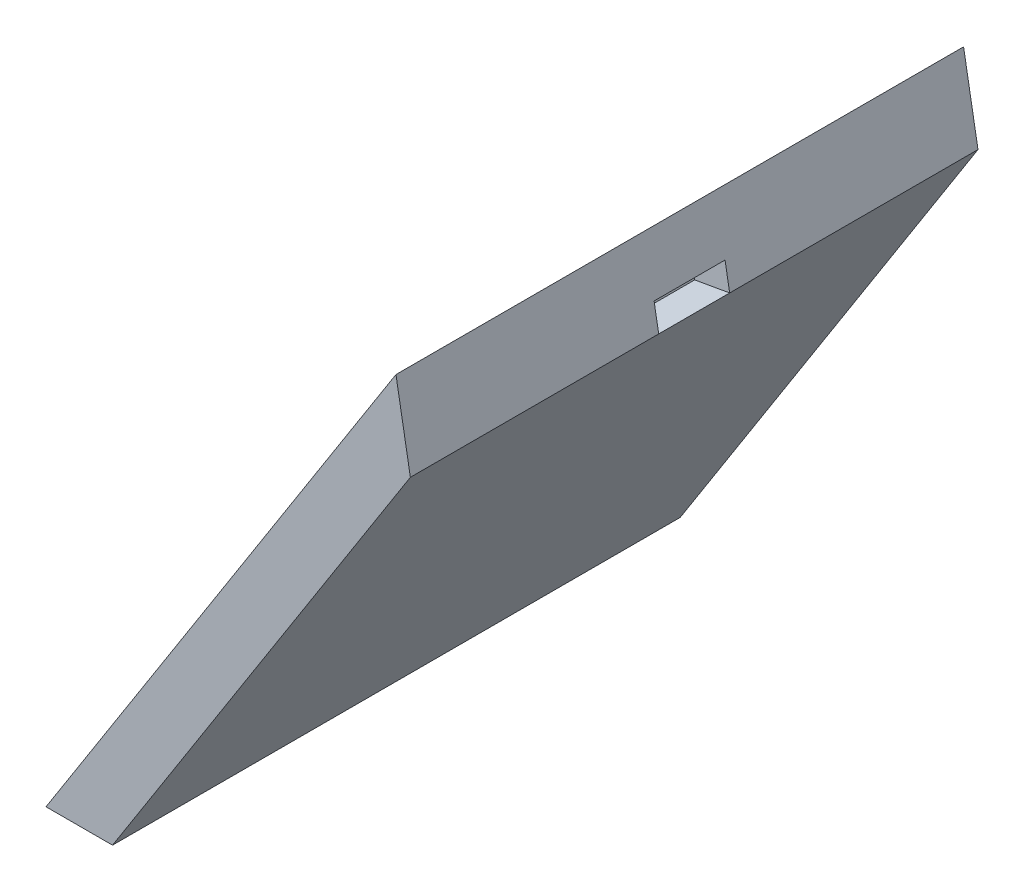
ISO-10303-21;
HEADER;
FILE_DESCRIPTION(('STEP AP214'),'2;1');
FILE_NAME('part.step','',(''),(''),'','','');
FILE_SCHEMA(('AUTOMOTIVE_DESIGN { 1 0 10303 214 1 1 1 1 }'));
ENDSEC;
DATA;
#1=APPLICATION_CONTEXT('core data for automotive mechanical design processes');
#2=APPLICATION_PROTOCOL_DEFINITION('international standard','automotive_design',2000,#1);
#3=PRODUCT_CONTEXT('',#1,'mechanical');
#4=PRODUCT('Part','Part','',(#3));
#5=PRODUCT_RELATED_PRODUCT_CATEGORY('part','',(#4));
#6=PRODUCT_DEFINITION_FORMATION('','',#4);
#7=PRODUCT_DEFINITION_CONTEXT('part definition',#1,'design');
#8=PRODUCT_DEFINITION('design','',#6,#7);
#9=PRODUCT_DEFINITION_SHAPE('','',#8);
#10=(LENGTH_UNIT() NAMED_UNIT(*) SI_UNIT(.MILLI.,.METRE.));
#11=(NAMED_UNIT(*) PLANE_ANGLE_UNIT() SI_UNIT($,.RADIAN.));
#12=(NAMED_UNIT(*) SI_UNIT($,.STERADIAN.) SOLID_ANGLE_UNIT());
#13=UNCERTAINTY_MEASURE_WITH_UNIT(LENGTH_MEASURE(1.E-05),#10,'distance_accuracy_value','');
#14=(GEOMETRIC_REPRESENTATION_CONTEXT(3) GLOBAL_UNCERTAINTY_ASSIGNED_CONTEXT((#13)) GLOBAL_UNIT_ASSIGNED_CONTEXT((#10,
#11,#12)) REPRESENTATION_CONTEXT('',''));
#15=CARTESIAN_POINT('',(0.,0.,0.));
#16=DIRECTION('',(0.,0.,1.));
#17=DIRECTION('',(1.,0.,0.));
#18=AXIS2_PLACEMENT_3D('',#15,#16,#17);
#19=CARTESIAN_POINT('',(39.4561840184058,61.9338029817856,64.));
#20=DIRECTION('',(0.843391445812887,-0.537299608346821,0.));
#21=DIRECTION('',(0.537299608346822,0.843391445812887,0.));
#22=AXIS2_PLACEMENT_3D('',#19,#20,#21);
#23=PLANE('',#22);
#24=DIRECTION('',(-0.537299608346822,-0.843391445812887,0.));
#25=VECTOR('',#24,1.);
#26=CARTESIAN_POINT('',(39.4561840184058,61.9338029817856,0.));
#27=LINE('',#26,#25);
#28=CARTESIAN_POINT('',(39.4561840184058,61.9338029817856,0.));
#29=VERTEX_POINT('',#28);
#30=CARTESIAN_POINT('',(0.,0.,0.));
#31=VERTEX_POINT('',#30);
#32=EDGE_CURVE('E159',#29,#31,#27,.T.);
#33=ORIENTED_EDGE('',*,*,#32,.T.);
#34=DIRECTION('',(0.,0.,-1.));
#35=VECTOR('',#34,1.);
#36=CARTESIAN_POINT('',(0.,0.,64.));
#37=LINE('',#36,#35);
#38=CARTESIAN_POINT('',(0.,0.,64.));
#39=VERTEX_POINT('',#38);
#40=EDGE_CURVE('E11',#39,#31,#37,.T.);
#41=ORIENTED_EDGE('',*,*,#40,.F.);
#42=DIRECTION('',(-0.537299608346822,-0.843391445812887,0.));
#43=VECTOR('',#42,1.);
#44=CARTESIAN_POINT('',(39.4561840184058,61.9338029817856,64.));
#45=LINE('',#44,#43);
#46=CARTESIAN_POINT('',(39.4561840184058,61.9338029817856,64.));
#47=VERTEX_POINT('',#46);
#48=EDGE_CURVE('E165',#47,#39,#45,.T.);
#49=ORIENTED_EDGE('',*,*,#48,.F.);
#50=DIRECTION('',(0.,0.,-1.));
#51=VECTOR('',#50,1.);
#52=CARTESIAN_POINT('',(39.4561840184058,61.9338029817856,64.));
#53=LINE('',#52,#51);
#54=EDGE_CURVE('E175',#47,#29,#53,.T.);
#55=ORIENTED_EDGE('',*,*,#54,.T.);
#56=EDGE_LOOP('',(#33,#41,#49,#55));
#57=FACE_BOUND('',#56,.T.);
#58=ADVANCED_FACE('F39',(#57),#23,.F.);
#59=CARTESIAN_POINT('',(0.,0.,64.));
#60=DIRECTION('',(0.,1.,0.));
#61=DIRECTION('',(0.,0.,1.));
#62=AXIS2_PLACEMENT_3D('',#59,#60,#61);
#63=PLANE('',#62);
#64=DIRECTION('',(1.,0.,0.));
#65=VECTOR('',#64,1.);
#66=CARTESIAN_POINT('',(0.,0.,0.));
#67=LINE('',#66,#65);
#68=CARTESIAN_POINT('',(7.5,0.,0.));
#69=VERTEX_POINT('',#68);
#70=EDGE_CURVE('E179',#31,#69,#67,.T.);
#71=ORIENTED_EDGE('',*,*,#70,.T.);
#72=DIRECTION('',(0.,0.,-1.));
#73=VECTOR('',#72,1.);
#74=CARTESIAN_POINT('',(7.5,0.,64.));
#75=LINE('',#74,#73);
#76=CARTESIAN_POINT('',(7.5,0.,64.));
#77=VERTEX_POINT('',#76);
#78=EDGE_CURVE('E47',#77,#69,#75,.T.);
#79=ORIENTED_EDGE('',*,*,#78,.F.);
#80=DIRECTION('',(1.,0.,0.));
#81=VECTOR('',#80,1.);
#82=CARTESIAN_POINT('',(0.,0.,64.));
#83=LINE('',#82,#81);
#84=EDGE_CURVE('E90',#39,#77,#83,.T.);
#85=ORIENTED_EDGE('',*,*,#84,.F.);
#86=ORIENTED_EDGE('',*,*,#40,.T.);
#87=EDGE_LOOP('',(#71,#79,#85,#86));
#88=FACE_BOUND('',#87,.T.);
#89=ADVANCED_FACE('F225',(#88),#63,.F.);
#90=CARTESIAN_POINT('',(7.5,0.,64.));
#91=DIRECTION('',(-0.843391445812887,0.537299608346822,0.));
#92=DIRECTION('',(-0.537299608346822,-0.843391445812887,0.));
#93=AXIS2_PLACEMENT_3D('',#90,#91,#92);
#94=PLANE('',#93);
#95=DIRECTION('',(0.537299608346822,0.843391445812887,0.));
#96=VECTOR('',#95,1.);
#97=CARTESIAN_POINT('',(7.5,0.,0.));
#98=LINE('',#97,#96);
#99=CARTESIAN_POINT('',(41.0812255216763,52.7119653633054,0.));
#100=VERTEX_POINT('',#99);
#101=EDGE_CURVE('E182',#69,#100,#98,.T.);
#102=ORIENTED_EDGE('',*,*,#101,.T.);
#103=DIRECTION('',(0.,0.,-1.));
#104=VECTOR('',#103,1.);
#105=CARTESIAN_POINT('',(41.0812255216763,52.7119653633054,64.));
#106=LINE('',#105,#104);
#107=CARTESIAN_POINT('',(41.0812255216763,52.7119653633054,28.));
#108=VERTEX_POINT('',#107);
#109=EDGE_CURVE('E190',#108,#100,#106,.T.);
#110=ORIENTED_EDGE('',*,*,#109,.F.);
#111=DIRECTION('',(0.,0.,-1.));
#112=VECTOR('',#111,1.);
#113=CARTESIAN_POINT('',(41.0812255216763,52.7119653633054,32.));
#114=LINE('',#113,#112);
#115=CARTESIAN_POINT('',(41.0812255216763,52.7119653633054,36.));
#116=VERTEX_POINT('',#115);
#117=EDGE_CURVE('E128',#116,#108,#114,.T.);
#118=ORIENTED_EDGE('',*,*,#117,.F.);
#119=CARTESIAN_POINT('',(41.0812255216763,52.7119653633054,64.));
#120=VERTEX_POINT('',#119);
#121=EDGE_CURVE('E191',#120,#116,#106,.T.);
#122=ORIENTED_EDGE('',*,*,#121,.F.);
#123=DIRECTION('',(0.537299608346822,0.843391445812887,0.));
#124=VECTOR('',#123,1.);
#125=CARTESIAN_POINT('',(7.5,0.,64.));
#126=LINE('',#125,#124);
#127=EDGE_CURVE('E170',#77,#120,#126,.T.);
#128=ORIENTED_EDGE('',*,*,#127,.F.);
#129=ORIENTED_EDGE('',*,*,#78,.T.);
#130=EDGE_LOOP('',(#102,#110,#118,#122,#128,#129));
#131=FACE_BOUND('',#130,.T.);
#132=ADVANCED_FACE('F199',(#131),#94,.F.);
#133=CARTESIAN_POINT('',(41.0812255216763,52.7119653633054,64.));
#134=DIRECTION('',(-0.984826325618199,-0.173542814225644,0.));
#135=DIRECTION('',(0.173542814225644,-0.9848263256182,0.));
#136=AXIS2_PLACEMENT_3D('',#133,#134,#135);
#137=PLANE('',#136);
#138=ORIENTED_EDGE('',*,*,#121,.T.);
#139=DIRECTION('',(0.173542814225642,-0.9848263256182,0.));
#140=VECTOR('',#139,1.);
#141=CARTESIAN_POINT('',(40.5605970789994,55.66644434016,36.));
#142=LINE('',#141,#140);
#143=CARTESIAN_POINT('',(40.5605970789994,55.66644434016,36.));
#144=VERTEX_POINT('',#143);
#145=EDGE_CURVE('E54',#144,#116,#142,.T.);
#146=ORIENTED_EDGE('',*,*,#145,.F.);
#147=DIRECTION('',(0.,0.,1.));
#148=VECTOR('',#147,1.);
#149=CARTESIAN_POINT('',(40.5605970789994,55.66644434016,28.));
#150=LINE('',#149,#148);
#151=CARTESIAN_POINT('',(40.5605970789994,55.66644434016,28.));
#152=VERTEX_POINT('',#151);
#153=EDGE_CURVE('E150',#152,#144,#150,.T.);
#154=ORIENTED_EDGE('',*,*,#153,.F.);
#155=DIRECTION('',(-0.173542814225642,0.9848263256182,0.));
#156=VECTOR('',#155,1.);
#157=CARTESIAN_POINT('',(41.0812255216763,52.7119653633054,28.));
#158=LINE('',#157,#156);
#159=EDGE_CURVE('E147',#108,#152,#158,.T.);
#160=ORIENTED_EDGE('',*,*,#159,.F.);
#161=ORIENTED_EDGE('',*,*,#109,.T.);
#162=DIRECTION('',(-0.173542814225644,0.984826325618199,0.));
#163=VECTOR('',#162,1.);
#164=CARTESIAN_POINT('',(41.0812255216763,52.7119653633054,0.));
#165=LINE('',#164,#163);
#166=EDGE_CURVE('E83',#100,#29,#165,.T.);
#167=ORIENTED_EDGE('',*,*,#166,.T.);
#168=ORIENTED_EDGE('',*,*,#54,.F.);
#169=DIRECTION('',(-0.173542814225644,0.984826325618199,0.));
#170=VECTOR('',#169,1.);
#171=CARTESIAN_POINT('',(41.0812255216763,52.7119653633054,64.));
#172=LINE('',#171,#170);
#173=EDGE_CURVE('E63',#120,#47,#172,.T.);
#174=ORIENTED_EDGE('',*,*,#173,.F.);
#175=EDGE_LOOP('',(#138,#146,#154,#160,#161,#167,#168,#174));
#176=FACE_BOUND('',#175,.T.);
#177=ADVANCED_FACE('F208',(#176),#137,.F.);
#178=CARTESIAN_POINT('',(0.,0.,64.));
#179=DIRECTION('',(0.,0.,1.));
#180=DIRECTION('',(1.,0.,0.));
#181=AXIS2_PLACEMENT_3D('',#178,#179,#180);
#182=PLANE('',#181);
#183=ORIENTED_EDGE('',*,*,#48,.T.);
#184=ORIENTED_EDGE('',*,*,#84,.T.);
#185=ORIENTED_EDGE('',*,*,#127,.T.);
#186=ORIENTED_EDGE('',*,*,#173,.T.);
#187=EDGE_LOOP('',(#183,#184,#185,#186));
#188=FACE_BOUND('',#187,.T.);
#189=ADVANCED_FACE('F221',(#188),#182,.T.);
#190=CARTESIAN_POINT('',(0.,0.,0.));
#191=DIRECTION('',(0.,0.,1.));
#192=DIRECTION('',(1.,0.,0.));
#193=AXIS2_PLACEMENT_3D('',#190,#191,#192);
#194=PLANE('',#193);
#195=ORIENTED_EDGE('',*,*,#32,.F.);
#196=ORIENTED_EDGE('',*,*,#166,.F.);
#197=ORIENTED_EDGE('',*,*,#101,.F.);
#198=ORIENTED_EDGE('',*,*,#70,.F.);
#199=EDGE_LOOP('',(#195,#196,#197,#198));
#200=FACE_BOUND('',#199,.T.);
#201=ADVANCED_FACE('F204',(#200),#194,.F.);
#202=CARTESIAN_POINT('',(36.6212917765266,54.9722730832574,36.));
#203=DIRECTION('',(0.,0.,1.));
#204=DIRECTION('',(1.,0.,0.));
#205=AXIS2_PLACEMENT_3D('',#202,#203,#204);
#206=PLANE('',#205);
#207=ORIENTED_EDGE('',*,*,#145,.T.);
#208=DIRECTION('',(0.984826325618199,0.173542814225644,0.));
#209=VECTOR('',#208,1.);
#210=CARTESIAN_POINT('',(37.1419202192035,52.0177941064028,36.));
#211=LINE('',#210,#209);
#212=CARTESIAN_POINT('',(37.1419202192035,52.0177941064028,36.));
#213=VERTEX_POINT('',#212);
#214=EDGE_CURVE('E156',#213,#116,#211,.T.);
#215=ORIENTED_EDGE('',*,*,#214,.F.);
#216=DIRECTION('',(0.173542814225642,-0.9848263256182,0.));
#217=VECTOR('',#216,1.);
#218=CARTESIAN_POINT('',(36.6212917765266,54.9722730832574,36.));
#219=LINE('',#218,#217);
#220=CARTESIAN_POINT('',(36.6212917765266,54.9722730832574,36.));
#221=VERTEX_POINT('',#220);
#222=EDGE_CURVE('E120',#221,#213,#219,.T.);
#223=ORIENTED_EDGE('',*,*,#222,.F.);
#224=DIRECTION('',(0.984826325618199,0.173542814225644,0.));
#225=VECTOR('',#224,1.);
#226=CARTESIAN_POINT('',(36.6212917765266,54.9722730832574,36.));
#227=LINE('',#226,#225);
#228=EDGE_CURVE('E160',#221,#144,#227,.T.);
#229=ORIENTED_EDGE('',*,*,#228,.T.);
#230=EDGE_LOOP('',(#207,#215,#223,#229));
#231=FACE_BOUND('',#230,.T.);
#232=ADVANCED_FACE('F213',(#231),#206,.F.);
#233=CARTESIAN_POINT('',(36.6212917765266,54.9722730832574,28.));
#234=DIRECTION('',(-0.173542814225644,0.984826325618199,0.));
#235=DIRECTION('',(-0.9848263256182,-0.173542814225644,0.));
#236=AXIS2_PLACEMENT_3D('',#233,#234,#235);
#237=PLANE('',#236);
#238=ORIENTED_EDGE('',*,*,#153,.T.);
#239=ORIENTED_EDGE('',*,*,#228,.F.);
#240=DIRECTION('',(0.,0.,1.));
#241=VECTOR('',#240,1.);
#242=CARTESIAN_POINT('',(36.6212917765266,54.9722730832574,28.));
#243=LINE('',#242,#241);
#244=CARTESIAN_POINT('',(36.6212917765266,54.9722730832574,28.));
#245=VERTEX_POINT('',#244);
#246=EDGE_CURVE('E138',#245,#221,#243,.T.);
#247=ORIENTED_EDGE('',*,*,#246,.F.);
#248=DIRECTION('',(0.984826325618199,0.173542814225644,0.));
#249=VECTOR('',#248,1.);
#250=CARTESIAN_POINT('',(36.6212917765266,54.9722730832574,28.));
#251=LINE('',#250,#249);
#252=EDGE_CURVE('E133',#245,#152,#251,.T.);
#253=ORIENTED_EDGE('',*,*,#252,.T.);
#254=EDGE_LOOP('',(#238,#239,#247,#253));
#255=FACE_BOUND('',#254,.T.);
#256=ADVANCED_FACE('F212',(#255),#237,.F.);
#257=CARTESIAN_POINT('',(37.1419202192035,52.0177941064028,28.));
#258=DIRECTION('',(0.,0.,-1.));
#259=DIRECTION('',(-1.,0.,0.));
#260=AXIS2_PLACEMENT_3D('',#257,#258,#259);
#261=PLANE('',#260);
#262=ORIENTED_EDGE('',*,*,#159,.T.);
#263=ORIENTED_EDGE('',*,*,#252,.F.);
#264=DIRECTION('',(-0.173542814225642,0.9848263256182,0.));
#265=VECTOR('',#264,1.);
#266=CARTESIAN_POINT('',(37.1419202192035,52.0177941064028,28.));
#267=LINE('',#266,#265);
#268=CARTESIAN_POINT('',(37.1419202192035,52.0177941064028,28.));
#269=VERTEX_POINT('',#268);
#270=EDGE_CURVE('E118',#269,#245,#267,.T.);
#271=ORIENTED_EDGE('',*,*,#270,.F.);
#272=DIRECTION('',(0.984826325618199,0.173542814225644,0.));
#273=VECTOR('',#272,1.);
#274=CARTESIAN_POINT('',(37.1419202192035,52.0177941064028,28.));
#275=LINE('',#274,#273);
#276=EDGE_CURVE('E125',#269,#108,#275,.T.);
#277=ORIENTED_EDGE('',*,*,#276,.T.);
#278=EDGE_LOOP('',(#262,#263,#271,#277));
#279=FACE_BOUND('',#278,.T.);
#280=ADVANCED_FACE('F135',(#279),#261,.F.);
#281=CARTESIAN_POINT('',(37.1419202192035,52.0177941064028,32.));
#282=DIRECTION('',(0.173542814225644,-0.984826325618199,0.));
#283=DIRECTION('',(0.9848263256182,0.173542814225644,0.));
#284=AXIS2_PLACEMENT_3D('',#281,#282,#283);
#285=PLANE('',#284);
#286=ORIENTED_EDGE('',*,*,#117,.T.);
#287=ORIENTED_EDGE('',*,*,#276,.F.);
#288=DIRECTION('',(0.,0.,-1.));
#289=VECTOR('',#288,1.);
#290=CARTESIAN_POINT('',(37.1419202192035,52.0177941064028,36.));
#291=LINE('',#290,#289);
#292=EDGE_CURVE('E113',#213,#269,#291,.T.);
#293=ORIENTED_EDGE('',*,*,#292,.F.);
#294=ORIENTED_EDGE('',*,*,#214,.T.);
#295=EDGE_LOOP('',(#286,#287,#293,#294));
#296=FACE_BOUND('',#295,.T.);
#297=ADVANCED_FACE('F126',(#296),#285,.F.);
#298=CARTESIAN_POINT('',(44.9136498330213,7.91453374713026,0.));
#299=DIRECTION('',(0.9848263256182,0.173542814225642,0.));
#300=DIRECTION('',(-0.173542814225642,0.9848263256182,0.));
#301=AXIS2_PLACEMENT_3D('',#298,#299,#300);
#302=PLANE('',#301);
#303=ORIENTED_EDGE('',*,*,#292,.T.);
#304=ORIENTED_EDGE('',*,*,#270,.T.);
#305=ORIENTED_EDGE('',*,*,#246,.T.);
#306=ORIENTED_EDGE('',*,*,#222,.T.);
#307=EDGE_LOOP('',(#303,#304,#305,#306));
#308=FACE_BOUND('',#307,.T.);
#309=ADVANCED_FACE('F115',(#308),#302,.T.);
#310=CLOSED_SHELL('',(#58,#89,#132,#177,#189,#201,#232,#256,#280,#297,#309));
#311=MANIFOLD_SOLID_BREP('B2',#310);
#312=ADVANCED_BREP_SHAPE_REPRESENTATION('',(#18,#311),#14);
#313=SHAPE_DEFINITION_REPRESENTATION(#9,#312);
ENDSEC;
END-ISO-10303-21;
